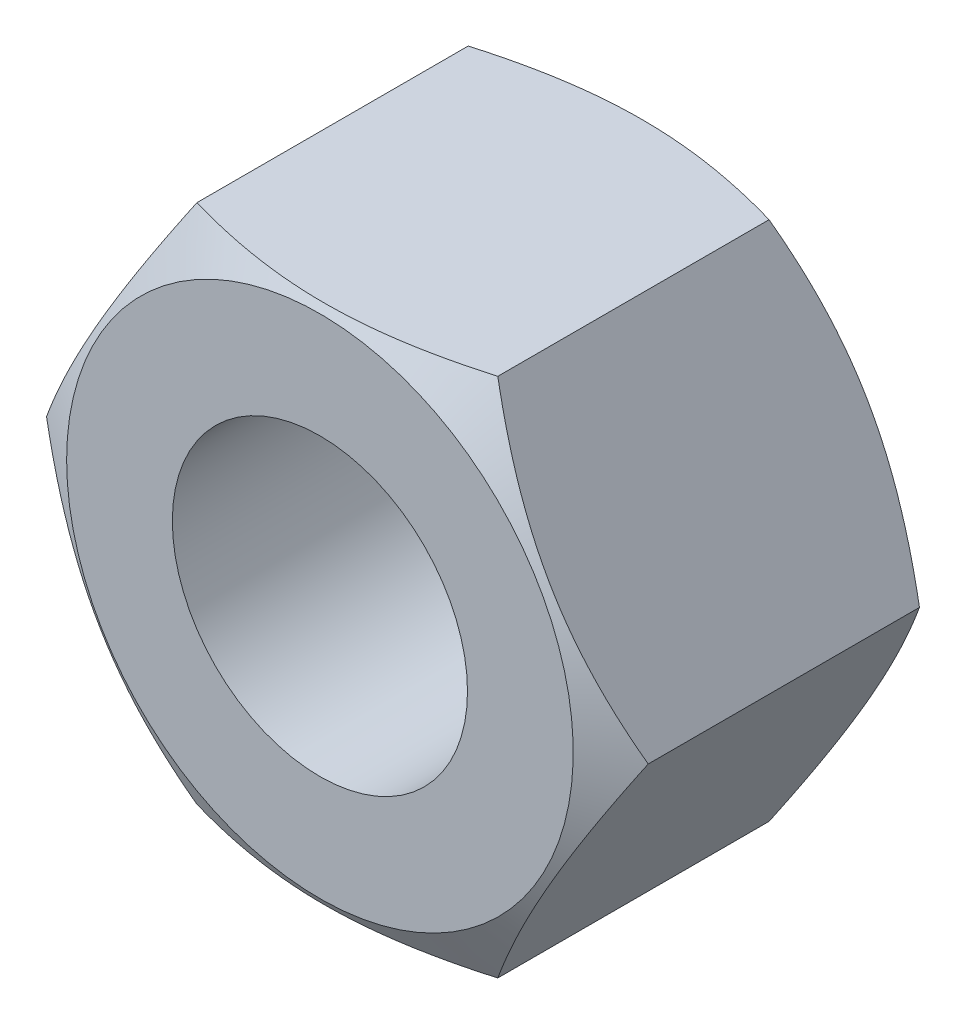
ISO-10303-21;
HEADER;
FILE_DESCRIPTION(('STEP AP214'),'2;1');
FILE_NAME('part.step','',(''),(''),'','','');
FILE_SCHEMA(('AUTOMOTIVE_DESIGN { 1 0 10303 214 1 1 1 1 }'));
ENDSEC;
DATA;
#1=APPLICATION_CONTEXT('core data for automotive mechanical design processes');
#2=APPLICATION_PROTOCOL_DEFINITION('international standard','automotive_design',2000,#1);
#3=PRODUCT_CONTEXT('',#1,'mechanical');
#4=PRODUCT('Part','Part','',(#3));
#5=PRODUCT_RELATED_PRODUCT_CATEGORY('part','',(#4));
#6=PRODUCT_DEFINITION_FORMATION('','',#4);
#7=PRODUCT_DEFINITION_CONTEXT('part definition',#1,'design');
#8=PRODUCT_DEFINITION('design','',#6,#7);
#9=PRODUCT_DEFINITION_SHAPE('','',#8);
#10=(LENGTH_UNIT() NAMED_UNIT(*) SI_UNIT(.MILLI.,.METRE.));
#11=(NAMED_UNIT(*) PLANE_ANGLE_UNIT() SI_UNIT($,.RADIAN.));
#12=(NAMED_UNIT(*) SI_UNIT($,.STERADIAN.) SOLID_ANGLE_UNIT());
#13=UNCERTAINTY_MEASURE_WITH_UNIT(LENGTH_MEASURE(1.E-05),#10,'distance_accuracy_value','');
#14=(GEOMETRIC_REPRESENTATION_CONTEXT(3) GLOBAL_UNCERTAINTY_ASSIGNED_CONTEXT((#13)) GLOBAL_UNIT_ASSIGNED_CONTEXT((#10,
#11,#12)) REPRESENTATION_CONTEXT('',''));
#15=CARTESIAN_POINT('',(0.,0.,0.));
#16=DIRECTION('',(0.,0.,1.));
#17=DIRECTION('',(1.,0.,0.));
#18=AXIS2_PLACEMENT_3D('',#15,#16,#17);
#19=CARTESIAN_POINT('',(-7.79422863405995,-13.5,-16.9));
#20=DIRECTION('',(0.,-1.,0.));
#21=DIRECTION('',(1.,0.,0.));
#22=AXIS2_PLACEMENT_3D('',#19,#20,#21);
#23=PLANE('',#22);
#24=CARTESIAN_POINT('',(-20.6414283385698,-13.5,-6.66211109437932));
#25=CARTESIAN_POINT('',(-20.3451927267808,-13.5,-6.518977463411));
#26=CARTESIAN_POINT('',(-20.0485981988826,-13.5,-6.37658702899362));
#27=CARTESIAN_POINT('',(-19.4546154711653,-13.5,-6.09346321338076));
#28=CARTESIAN_POINT('',(-19.1572272626184,-13.5,-5.9527298505004));
#29=CARTESIAN_POINT('',(-18.2636707981027,-13.5,-5.53323036770217));
#30=CARTESIAN_POINT('',(-17.6662075189161,-13.5,-5.25721176821301));
#31=CARTESIAN_POINT('',(-16.4637078583372,-13.5,-4.71270348756273));
#32=CARTESIAN_POINT('',(-15.8586476857994,-13.5,-4.44426621498114));
#33=CARTESIAN_POINT('',(-14.6435437872288,-13.5,-3.91896041597388));
#34=CARTESIAN_POINT('',(-14.0335003238415,-13.5,-3.66209128443499));
#35=CARTESIAN_POINT('',(-12.8000265686481,-13.5,-3.16001432582822));
#36=CARTESIAN_POINT('',(-12.1765235408417,-13.5,-2.91498425361256));
#37=CARTESIAN_POINT('',(-10.9221482383828,-13.5,-2.44418904112871));
#38=CARTESIAN_POINT('',(-10.2912751521263,-13.5,-2.21842604576006));
#39=CARTESIAN_POINT('',(-9.02248270739626,-13.5,-1.79225611887085));
#40=CARTESIAN_POINT('',(-8.38458169534984,-13.5,-1.59179501541417));
#41=CARTESIAN_POINT('',(-7.09965072984675,-13.5,-1.22274885775889));
#42=CARTESIAN_POINT('',(-6.45262373924203,-13.5,-1.05415370276057));
#43=CARTESIAN_POINT('',(-5.47511363721056,-13.5,-0.831345367377567));
#44=CARTESIAN_POINT('',(-5.14803929115925,-13.5,-0.762077517534783));
#45=CARTESIAN_POINT('',(-4.49171982223577,-13.5,-0.634667658219002));
#46=CARTESIAN_POINT('',(-4.16247474862902,-13.5,-0.576525397139815));
#47=CARTESIAN_POINT('',(-3.50203087840567,-13.5,-0.472398237436892));
#48=CARTESIAN_POINT('',(-3.17083192659608,-13.5,-0.426414318189659));
#49=CARTESIAN_POINT('',(-2.50688059847814,-13.5,-0.347531347849764));
#50=CARTESIAN_POINT('',(-2.17412827826878,-13.5,-0.314631827864259));
#51=CARTESIAN_POINT('',(-1.5096319936846,-13.5,-0.262798795995755));
#52=CARTESIAN_POINT('',(-1.17789481074892,-13.5,-0.243778914869455));
#53=CARTESIAN_POINT('',(-0.513914290149798,-13.5,-0.219805703775309));
#54=CARTESIAN_POINT('',(-0.181670960174335,-13.5,-0.214852162240556));
#55=CARTESIAN_POINT('',(0.48263327442963,-13.5,-0.219128943000607));
#56=CARTESIAN_POINT('',(0.814694204093622,-13.5,-0.228355313208164));
#57=CARTESIAN_POINT('',(1.47813858620015,-13.5,-0.260763416881033));
#58=CARTESIAN_POINT('',(1.80952200208806,-13.5,-0.283945884384676));
#59=CARTESIAN_POINT('',(2.61341486376691,-13.5,-0.356629567708614));
#60=CARTESIAN_POINT('',(3.0853008080866,-13.5,-0.413162953040908));
#61=CARTESIAN_POINT('',(4.02535578598045,-13.5,-0.551374254135369));
#62=CARTESIAN_POINT('',(4.49352425354811,-13.5,-0.63305592631876));
#63=CARTESIAN_POINT('',(5.89328012633227,-13.5,-0.911724054982504));
#64=CARTESIAN_POINT('',(6.81828677930942,-13.5,-1.14214702482224));
#65=CARTESIAN_POINT('',(8.20188355841416,-13.5,-1.53921658252512));
#66=CARTESIAN_POINT('',(8.66770896091092,-13.5,-1.68207852899575));
#67=CARTESIAN_POINT('',(9.59485931230503,-13.5,-1.98198274248303));
#68=CARTESIAN_POINT('',(10.0561838521939,-13.5,-2.13902628517189));
#69=CARTESIAN_POINT('',(10.9720319069463,-13.5,-2.46395228175173));
#70=CARTESIAN_POINT('',(11.4265791181124,-13.5,-2.63176850524613));
#71=CARTESIAN_POINT('',(12.1055407344645,-13.5,-2.89072738097578));
#72=CARTESIAN_POINT('',(12.3313483643177,-13.5,-2.97823799001403));
#73=CARTESIAN_POINT('',(12.7820876205276,-13.5,-3.1554748324667));
#74=CARTESIAN_POINT('',(13.0070192641565,-13.5,-3.24520102193667));
#75=CARTESIAN_POINT('',(13.2315433934192,-13.5,-3.33593491894165));
#76=B_SPLINE_CURVE_WITH_KNOTS('',3,(#24,#25,#26,#27,#28,#29,#30,#31,#32,#33,#34,#35,#36,#37,#38,
#39,#40,#41,#42,#43,#44,#45,#46,#47,#48,#49,#50,#51,#52,#53,#54,#55,#56,#57,#58,#59,#60,#61,#62,
#63,#64,#65,#66,#67,#68,#69,#70,#71,#72,#73,#74,#75),.UNSPECIFIED.,.F.,.F.,(4,2,2,2,2,2,2,2,2,2,
2,2,2,2,2,2,2,2,2,2,2,2,2,2,2,4),(0.,0.987006155465804,1.97402320980206,3.94838004987342,
5.93408786164919,7.91969168290323,9.92921514417375,11.9389620238043,13.9443302417995,
15.9490617325321,16.9518889656412,17.954693517041,18.9575788215754,19.960428183449,
20.9569825950948,21.9535220178338,22.9497837451503,23.9460978766726,25.3710686514636,
26.7962523787141,29.6521174036425,31.1137236922342,32.5754615874032,34.0289432911614,
34.755448624192,35.4819395590642),.UNSPECIFIED.);
#77=CARTESIAN_POINT('',(-7.79422863405994,-13.5,-1.42227771688614));
#78=VERTEX_POINT('',#77);
#79=CARTESIAN_POINT('',(7.79422863405995,-13.5,-1.42227771688614));
#80=VERTEX_POINT('',#79);
#81=EDGE_CURVE('E62',#78,#80,#76,.T.);
#82=ORIENTED_EDGE('',*,*,#81,.F.);
#83=DIRECTION('',(0.,0.,1.));
#84=VECTOR('',#83,1.);
#85=CARTESIAN_POINT('',(-7.79422863405995,-13.5,-16.9));
#86=LINE('',#85,#84);
#87=CARTESIAN_POINT('',(-7.79422863405994,-13.5,-15.4777222831139));
#88=VERTEX_POINT('',#87);
#89=EDGE_CURVE('E11',#88,#78,#86,.T.);
#90=ORIENTED_EDGE('',*,*,#89,.F.);
#91=CARTESIAN_POINT('',(-20.6414283385698,-13.5,-10.2378889056207));
#92=CARTESIAN_POINT('',(-20.3451927267808,-13.5,-10.381022536589));
#93=CARTESIAN_POINT('',(-20.0485981988826,-13.5,-10.5234129710064));
#94=CARTESIAN_POINT('',(-19.4546154711653,-13.5,-10.8065367866192));
#95=CARTESIAN_POINT('',(-19.1572272626184,-13.5,-10.9472701494996));
#96=CARTESIAN_POINT('',(-18.2636707981027,-13.5,-11.3667696322978));
#97=CARTESIAN_POINT('',(-17.6662075189161,-13.5,-11.642788231787));
#98=CARTESIAN_POINT('',(-16.4637078583372,-13.5,-12.1872965124373));
#99=CARTESIAN_POINT('',(-15.8586476857994,-13.5,-12.4557337850189));
#100=CARTESIAN_POINT('',(-14.6435437872288,-13.5,-12.9810395840261));
#101=CARTESIAN_POINT('',(-14.0335003238415,-13.5,-13.237908715565));
#102=CARTESIAN_POINT('',(-12.8000265686481,-13.5,-13.7399856741718));
#103=CARTESIAN_POINT('',(-12.1765235408417,-13.5,-13.9850157463874));
#104=CARTESIAN_POINT('',(-10.9221482383828,-13.5,-14.4558109588713));
#105=CARTESIAN_POINT('',(-10.2912751521263,-13.5,-14.6815739542399));
#106=CARTESIAN_POINT('',(-9.02248270739626,-13.5,-15.1077438811291));
#107=CARTESIAN_POINT('',(-8.38458169534985,-13.5,-15.3082049845858));
#108=CARTESIAN_POINT('',(-7.09965072984675,-13.5,-15.6772511422411));
#109=CARTESIAN_POINT('',(-6.45262373924204,-13.5,-15.8458462972394));
#110=CARTESIAN_POINT('',(-5.47511363721056,-13.5,-16.0686546326224));
#111=CARTESIAN_POINT('',(-5.14803929115926,-13.5,-16.1379224824652));
#112=CARTESIAN_POINT('',(-4.49171982223577,-13.5,-16.265332341781));
#113=CARTESIAN_POINT('',(-4.16247474862903,-13.5,-16.3234746028602));
#114=CARTESIAN_POINT('',(-3.50203087840568,-13.5,-16.4276017625631));
#115=CARTESIAN_POINT('',(-3.17083192659609,-13.5,-16.4735856818103));
#116=CARTESIAN_POINT('',(-2.50688059847815,-13.5,-16.5524686521502));
#117=CARTESIAN_POINT('',(-2.17412827826878,-13.5,-16.5853681721357));
#118=CARTESIAN_POINT('',(-1.5096319936846,-13.5,-16.6372012040042));
#119=CARTESIAN_POINT('',(-1.17789481074893,-13.5,-16.6562210851305));
#120=CARTESIAN_POINT('',(-0.513914290149802,-13.5,-16.6801942962247));
#121=CARTESIAN_POINT('',(-0.181670960174338,-13.5,-16.6851478377594));
#122=CARTESIAN_POINT('',(0.48263327442963,-13.5,-16.6808710569994));
#123=CARTESIAN_POINT('',(0.814694204093623,-13.5,-16.6716446867918));
#124=CARTESIAN_POINT('',(1.47813858620016,-13.5,-16.639236583119));
#125=CARTESIAN_POINT('',(1.80952200208806,-13.5,-16.6160541156153));
#126=CARTESIAN_POINT('',(2.61341486376691,-13.5,-16.5433704322914));
#127=CARTESIAN_POINT('',(3.0853008080866,-13.5,-16.4868370469591));
#128=CARTESIAN_POINT('',(4.02535578598046,-13.5,-16.3486257458646));
#129=CARTESIAN_POINT('',(4.49352425354812,-13.5,-16.2669440736812));
#130=CARTESIAN_POINT('',(5.89328012633228,-13.5,-15.9882759450175));
#131=CARTESIAN_POINT('',(6.81828677930943,-13.5,-15.7578529751778));
#132=CARTESIAN_POINT('',(8.20188355841417,-13.5,-15.3607834174749));
#133=CARTESIAN_POINT('',(8.66770896091093,-13.5,-15.2179214710042));
#134=CARTESIAN_POINT('',(9.59485931230504,-13.5,-14.918017257517));
#135=CARTESIAN_POINT('',(10.0561838521939,-13.5,-14.7609737148281));
#136=CARTESIAN_POINT('',(10.9720319069463,-13.5,-14.4360477182483));
#137=CARTESIAN_POINT('',(11.4265791181124,-13.5,-14.2682314947539));
#138=CARTESIAN_POINT('',(12.1055407344645,-13.5,-14.0092726190242));
#139=CARTESIAN_POINT('',(12.3313483643178,-13.5,-13.921762009986));
#140=CARTESIAN_POINT('',(12.7820876205276,-13.5,-13.7445251675333));
#141=CARTESIAN_POINT('',(13.0070192641565,-13.5,-13.6547989780633));
#142=CARTESIAN_POINT('',(13.2315433934192,-13.5,-13.5640650810583));
#143=B_SPLINE_CURVE_WITH_KNOTS('',3,(#91,#92,#93,#94,#95,#96,#97,#98,#99,#100,#101,#102,#103,
#104,#105,#106,#107,#108,#109,#110,#111,#112,#113,#114,#115,#116,#117,#118,#119,#120,#121,#122,
#123,#124,#125,#126,#127,#128,#129,#130,#131,#132,#133,#134,#135,#136,#137,#138,#139,#140,#141,
#142),.UNSPECIFIED.,.F.,.F.,(4,2,2,2,2,2,2,2,2,2,2,2,2,2,2,2,2,2,2,2,2,2,2,2,2,4),(0.,
0.9870061554658,1.97402320980206,3.94838004987342,5.93408786164919,7.91969168290323,
9.92921514417375,11.9389620238043,13.9443302417995,15.9490617325321,16.9518889656412,
17.954693517041,18.9575788215754,19.960428183449,20.9569825950948,21.9535220178339,
22.9497837451503,23.9460978766726,25.3710686514636,26.7962523787141,29.6521174036425,
31.1137236922342,32.5754615874032,34.0289432911615,34.755448624192,35.4819395590642),.UNSPECIFIED.);
#144=CARTESIAN_POINT('',(7.79422863405995,-13.5,-15.4777222831139));
#145=VERTEX_POINT('',#144);
#146=EDGE_CURVE('E141',#145,#88,#143,.F.);
#147=ORIENTED_EDGE('',*,*,#146,.F.);
#148=DIRECTION('',(0.,0.,1.));
#149=VECTOR('',#148,1.);
#150=CARTESIAN_POINT('',(7.79422863405995,-13.5,-16.9));
#151=LINE('',#150,#149);
#152=EDGE_CURVE('E49',#145,#80,#151,.T.);
#153=ORIENTED_EDGE('',*,*,#152,.T.);
#154=EDGE_LOOP('',(#82,#90,#147,#153));
#155=FACE_BOUND('',#154,.T.);
#156=ADVANCED_FACE('F45',(#155),#23,.T.);
#157=CARTESIAN_POINT('',(-15.5884572681199,0.,-16.9));
#158=DIRECTION('',(-0.866025403784438,-0.5,0.));
#159=DIRECTION('',(0.5,-0.866025403784439,0.));
#160=AXIS2_PLACEMENT_3D('',#157,#158,#159);
#161=PLANE('',#160);
#162=CARTESIAN_POINT('',(-15.5885727381737,0.000200000000001838,-1.42234438429355));
#163=CARTESIAN_POINT('',(-15.4172585590749,-0.296524862256052,-1.32344235279898));
#164=CARTESIAN_POINT('',(-15.2452761625602,-0.59440711102707,-1.22902828985184));
#165=CARTESIAN_POINT('',(-14.899932271808,-1.19256027589336,-1.05042360582435));
#166=CARTESIAN_POINT('',(-14.7265703438498,-1.49283194321508,-0.966236347209941));
#167=CARTESIAN_POINT('',(-14.3781323446498,-2.09634426111705,-0.809216917781722));
#168=CARTESIAN_POINT('',(-14.2030532243114,-2.39959019288772,-0.736411613541345));
#169=CARTESIAN_POINT('',(-13.8516783921556,-3.00818925468255,-0.603719435353392));
#170=CARTESIAN_POINT('',(-13.6753827503359,-3.31354226346713,-0.543831824423678));
#171=CARTESIAN_POINT('',(-13.3260922517071,-3.91853115369337,-0.439522261585169));
#172=CARTESIAN_POINT('',(-13.1531233267183,-4.21812211990455,-0.394755064570657));
#173=CARTESIAN_POINT('',(-12.8063928945171,-4.81867684500741,-0.319690286629368));
#174=CARTESIAN_POINT('',(-12.632631372114,-5.11964063020999,-0.289392984213117));
#175=CARTESIAN_POINT('',(-12.284816427587,-5.72207378576257,-0.244032985143185));
#176=CARTESIAN_POINT('',(-12.1107635996896,-6.02354212688191,-0.228952184974798));
#177=CARTESIAN_POINT('',(-11.7624972706325,-6.62675710337428,-0.214349514613708));
#178=CARTESIAN_POINT('',(-11.5882837746037,-6.92850372986035,-0.214827163673637));
#179=CARTESIAN_POINT('',(-11.2625921885179,-7.49261810455857,-0.230254684590672));
#180=CARTESIAN_POINT('',(-11.1110908897329,-7.75502605146695,-0.243322769939135));
#181=CARTESIAN_POINT('',(-10.8084367795058,-8.27923834749989,-0.280978920904704));
#182=CARTESIAN_POINT('',(-10.6572839934736,-8.54104265261318,-0.305567801373089));
#183=CARTESIAN_POINT('',(-10.3554090101392,-9.06390546128244,-0.365836816382126));
#184=CARTESIAN_POINT('',(-10.2046872726121,-9.32496316848428,-0.40152611145324));
#185=CARTESIAN_POINT('',(-9.90395041171111,-9.84585469127366,-0.483369789658436));
#186=CARTESIAN_POINT('',(-9.75393533708269,-10.1056884224313,-0.529524884237762));
#187=CARTESIAN_POINT('',(-9.29855621514213,-10.8944281983385,-0.684855610218756));
#188=CARTESIAN_POINT('',(-8.99451087657251,-11.4210501725455,-0.809519384371486));
#189=CARTESIAN_POINT('',(-8.39095390705817,-12.4664415090067,-1.09245521851808));
#190=CARTESIAN_POINT('',(-8.09143454846038,-12.9852242559485,-1.2506608293193));
#191=CARTESIAN_POINT('',(-7.79411316400611,-13.5002,-1.42234438429354));
#192=B_SPLINE_CURVE_WITH_KNOTS('',3,(#162,#163,#164,#165,#166,#167,#168,#169,#170,#171,#172,
#173,#174,#175,#176,#177,#178,#179,#180,#181,#182,#183,#184,#185,#186,#187,#188,#189,#190,#191),
.UNSPECIFIED.,.F.,.F.,(4,2,2,2,2,2,2,2,2,2,2,2,2,2,4),(0.,1.0698794936454,2.14010980578041,
3.21282939735428,4.28548777177524,5.33167033690336,6.37787303770781,7.42282956789443,
8.46775380954026,9.37738732544599,10.2870851882952,11.1975357730373,12.1080482670512,
13.9691139233208,15.8265265395635),.UNSPECIFIED.);
#193=CARTESIAN_POINT('',(-15.5884572681199,0.,-1.42227771688614));
#194=VERTEX_POINT('',#193);
#195=EDGE_CURVE('E102',#194,#78,#192,.T.);
#196=ORIENTED_EDGE('',*,*,#195,.F.);
#197=DIRECTION('',(0.,0.,1.));
#198=VECTOR('',#197,1.);
#199=CARTESIAN_POINT('',(-15.5884572681199,0.,-16.9));
#200=LINE('',#199,#198);
#201=CARTESIAN_POINT('',(-15.5884572681199,0.,-15.4777222831139));
#202=VERTEX_POINT('',#201);
#203=EDGE_CURVE('E54',#202,#194,#200,.T.);
#204=ORIENTED_EDGE('',*,*,#203,.F.);
#205=CARTESIAN_POINT('',(-7.79411316400611,-13.5002,-15.4776556157065));
#206=CARTESIAN_POINT('',(-7.9654273431049,-13.2034751377439,-15.576557647201));
#207=CARTESIAN_POINT('',(-8.13740973961965,-12.9055928889729,-15.6709717101482));
#208=CARTESIAN_POINT('',(-8.48275363037183,-12.3074397241066,-15.8495763941756));
#209=CARTESIAN_POINT('',(-8.65611555833005,-12.0071680567849,-15.9337636527901));
#210=CARTESIAN_POINT('',(-9.00455355753,-11.403655738883,-16.0907830822183));
#211=CARTESIAN_POINT('',(-9.17963267786846,-11.1004098071123,-16.1635883864587));
#212=CARTESIAN_POINT('',(-9.53100751002426,-10.4918107453174,-16.2962805646466));
#213=CARTESIAN_POINT('',(-9.7073031518439,-10.1864577365329,-16.3561681755763));
#214=CARTESIAN_POINT('',(-10.0565936504727,-9.58146884630663,-16.4604777384148));
#215=CARTESIAN_POINT('',(-10.2295625754616,-9.28187788009545,-16.5052449354293));
#216=CARTESIAN_POINT('',(-10.5762930076628,-8.68132315499259,-16.5803097133706));
#217=CARTESIAN_POINT('',(-10.7500545300658,-8.38035936979001,-16.6106070157869));
#218=CARTESIAN_POINT('',(-11.0978694745929,-7.77792621423743,-16.6559670148568));
#219=CARTESIAN_POINT('',(-11.2719223024903,-7.47645787311809,-16.6710478150252));
#220=CARTESIAN_POINT('',(-11.6201886315474,-6.87324289662572,-16.6856504853863));
#221=CARTESIAN_POINT('',(-11.7944021275761,-6.57149627013965,-16.6851728363264));
#222=CARTESIAN_POINT('',(-12.1200937136619,-6.00738189544143,-16.6697453154093));
#223=CARTESIAN_POINT('',(-12.271595012447,-5.74497394853305,-16.6566772300609));
#224=CARTESIAN_POINT('',(-12.5742491226741,-5.22076165250011,-16.6190210790953));
#225=CARTESIAN_POINT('',(-12.7254019087062,-4.95895734738682,-16.5944321986269));
#226=CARTESIAN_POINT('',(-13.0272768920407,-4.43609453871757,-16.5341631836179));
#227=CARTESIAN_POINT('',(-13.1779986295677,-4.17503683151572,-16.4984738885468));
#228=CARTESIAN_POINT('',(-13.4787354904687,-3.65414530872635,-16.4166302103416));
#229=CARTESIAN_POINT('',(-13.6287505650971,-3.39431157756869,-16.3704751157622));
#230=CARTESIAN_POINT('',(-14.0841296870377,-2.60557180166152,-16.2151443897812));
#231=CARTESIAN_POINT('',(-14.3881750256073,-2.07894982745447,-16.0904806156285));
#232=CARTESIAN_POINT('',(-14.9917319951217,-1.03355849099333,-15.8075447814819));
#233=CARTESIAN_POINT('',(-15.2912513537195,-0.514775744051517,-15.6493391706807));
#234=CARTESIAN_POINT('',(-15.5885727381737,0.000200000000001723,-15.4776556157065));
#235=B_SPLINE_CURVE_WITH_KNOTS('',3,(#205,#206,#207,#208,#209,#210,#211,#212,#213,#214,#215,
#216,#217,#218,#219,#220,#221,#222,#223,#224,#225,#226,#227,#228,#229,#230,#231,#232,#233,#234),
.UNSPECIFIED.,.F.,.F.,(4,2,2,2,2,2,2,2,2,2,2,2,2,2,4),(0.,1.0698794936454,2.14010980578041,
3.21282939735428,4.28548777177524,5.33167033690335,6.3778730377078,7.42282956789442,
8.46775380954025,9.37738732544598,10.2870851882952,11.1975357730373,12.1080482670512,
13.9691139233208,15.8265265395635),.UNSPECIFIED.);
#236=EDGE_CURVE('E149',#88,#202,#235,.T.);
#237=ORIENTED_EDGE('',*,*,#236,.F.);
#238=ORIENTED_EDGE('',*,*,#89,.T.);
#239=EDGE_LOOP('',(#196,#204,#237,#238));
#240=FACE_BOUND('',#239,.T.);
#241=ADVANCED_FACE('F112',(#240),#161,.T.);
#242=CARTESIAN_POINT('',(-7.79422863405995,13.5,-16.9));
#243=DIRECTION('',(-0.866025403784439,0.5,0.));
#244=DIRECTION('',(-0.5,-0.866025403784439,0.));
#245=AXIS2_PLACEMENT_3D('',#242,#243,#244);
#246=PLANE('',#245);
#247=CARTESIAN_POINT('',(-7.79411316400611,13.5002,-1.42234438429355));
#248=CARTESIAN_POINT('',(-7.9654273431049,13.2034751377439,-1.32344235279898));
#249=CARTESIAN_POINT('',(-8.13740973961966,12.9055928889729,-1.22902828985184));
#250=CARTESIAN_POINT('',(-8.48275363037184,12.3074397241066,-1.05042360582435));
#251=CARTESIAN_POINT('',(-8.65611555833005,12.0071680567849,-0.96623634720994));
#252=CARTESIAN_POINT('',(-9.00455355753,11.403655738883,-0.809216917781722));
#253=CARTESIAN_POINT('',(-9.17963267786847,11.1004098071123,-0.736411613541346));
#254=CARTESIAN_POINT('',(-9.53100751002426,10.4918107453174,-0.603719435353392));
#255=CARTESIAN_POINT('',(-9.7073031518439,10.1864577365329,-0.543831824423678));
#256=CARTESIAN_POINT('',(-10.0565936504728,9.58146884630663,-0.439522261585169));
#257=CARTESIAN_POINT('',(-10.2295625754616,9.28187788009545,-0.394755064570657));
#258=CARTESIAN_POINT('',(-10.5762930076628,8.68132315499259,-0.319690286629369));
#259=CARTESIAN_POINT('',(-10.7500545300658,8.38035936979001,-0.289392984213118));
#260=CARTESIAN_POINT('',(-11.0978694745929,7.77792621423743,-0.244032985143186));
#261=CARTESIAN_POINT('',(-11.2719223024903,7.47645787311809,-0.228952184974799));
#262=CARTESIAN_POINT('',(-11.6201886315474,6.87324289662572,-0.214349514613708));
#263=CARTESIAN_POINT('',(-11.7944021275762,6.57149627013965,-0.214827163673638));
#264=CARTESIAN_POINT('',(-12.1200937136619,6.00738189544143,-0.230254684590673));
#265=CARTESIAN_POINT('',(-12.271595012447,5.74497394853305,-0.243322769939136));
#266=CARTESIAN_POINT('',(-12.5742491226741,5.22076165250011,-0.280978920904706));
#267=CARTESIAN_POINT('',(-12.7254019087062,4.95895734738682,-0.305567801373091));
#268=CARTESIAN_POINT('',(-13.0272768920407,4.43609453871756,-0.365836816382128));
#269=CARTESIAN_POINT('',(-13.1779986295677,4.17503683151572,-0.401526111453241));
#270=CARTESIAN_POINT('',(-13.4787354904687,3.65414530872635,-0.483369789658437));
#271=CARTESIAN_POINT('',(-13.6287505650971,3.39431157756869,-0.529524884237764));
#272=CARTESIAN_POINT('',(-14.0841296870377,2.60557180166153,-0.68485561021876));
#273=CARTESIAN_POINT('',(-14.3881750256073,2.07894982745447,-0.80951938437149));
#274=CARTESIAN_POINT('',(-14.9917319951217,1.03355849099334,-1.09245521851808));
#275=CARTESIAN_POINT('',(-15.2912513537195,0.514775744051519,-1.2506608293193));
#276=CARTESIAN_POINT('',(-15.5885727381737,-0.000199999999998483,-1.42234438429355));
#277=B_SPLINE_CURVE_WITH_KNOTS('',3,(#247,#248,#249,#250,#251,#252,#253,#254,#255,#256,#257,
#258,#259,#260,#261,#262,#263,#264,#265,#266,#267,#268,#269,#270,#271,#272,#273,#274,#275,#276),
.UNSPECIFIED.,.F.,.F.,(4,2,2,2,2,2,2,2,2,2,2,2,2,2,4),(0.,1.0698794936454,2.14010980578041,
3.21282939735429,4.28548777177525,5.33167033690336,6.37787303770781,7.42282956789443,
8.46775380954026,9.37738732544599,10.2870851882952,11.1975357730373,12.1080482670512,
13.9691139233208,15.8265265395635),.UNSPECIFIED.);
#278=CARTESIAN_POINT('',(-7.79422863405996,13.5,-1.42227771688614));
#279=VERTEX_POINT('',#278);
#280=EDGE_CURVE('E98',#279,#194,#277,.T.);
#281=ORIENTED_EDGE('',*,*,#280,.F.);
#282=DIRECTION('',(0.,0.,1.));
#283=VECTOR('',#282,1.);
#284=CARTESIAN_POINT('',(-7.79422863405995,13.5,-16.9));
#285=LINE('',#284,#283);
#286=CARTESIAN_POINT('',(-7.79422863405995,13.5,-15.4777222831139));
#287=VERTEX_POINT('',#286);
#288=EDGE_CURVE('E119',#287,#279,#285,.T.);
#289=ORIENTED_EDGE('',*,*,#288,.F.);
#290=CARTESIAN_POINT('',(-15.5885727381737,-0.000199999999998287,-15.4776556157065));
#291=CARTESIAN_POINT('',(-15.4172585590749,0.296524862256056,-15.576557647201));
#292=CARTESIAN_POINT('',(-15.2452761625602,0.594407111027075,-15.6709717101482));
#293=CARTESIAN_POINT('',(-14.899932271808,1.19256027589336,-15.8495763941756));
#294=CARTESIAN_POINT('',(-14.7265703438498,1.49283194321508,-15.9337636527901));
#295=CARTESIAN_POINT('',(-14.3781323446498,2.09634426111705,-16.0907830822183));
#296=CARTESIAN_POINT('',(-14.2030532243114,2.39959019288773,-16.1635883864587));
#297=CARTESIAN_POINT('',(-13.8516783921556,3.00818925468256,-16.2962805646466));
#298=CARTESIAN_POINT('',(-13.6753827503359,3.31354226346714,-16.3561681755763));
#299=CARTESIAN_POINT('',(-13.3260922517071,3.91853115369338,-16.4604777384148));
#300=CARTESIAN_POINT('',(-13.1531233267183,4.21812211990455,-16.5052449354293));
#301=CARTESIAN_POINT('',(-12.8063928945171,4.81867684500741,-16.5803097133706));
#302=CARTESIAN_POINT('',(-12.632631372114,5.11964063020999,-16.6106070157869));
#303=CARTESIAN_POINT('',(-12.284816427587,5.72207378576257,-16.6559670148568));
#304=CARTESIAN_POINT('',(-12.1107635996896,6.02354212688191,-16.6710478150252));
#305=CARTESIAN_POINT('',(-11.7624972706325,6.62675710337429,-16.6856504853863));
#306=CARTESIAN_POINT('',(-11.5882837746037,6.92850372986036,-16.6851728363264));
#307=CARTESIAN_POINT('',(-11.2625921885179,7.49261810455857,-16.6697453154093));
#308=CARTESIAN_POINT('',(-11.1110908897329,7.75502605146696,-16.6566772300609));
#309=CARTESIAN_POINT('',(-10.8084367795058,8.27923834749989,-16.6190210790953));
#310=CARTESIAN_POINT('',(-10.6572839934736,8.54104265261318,-16.5944321986269));
#311=CARTESIAN_POINT('',(-10.3554090101392,9.06390546128244,-16.5341631836179));
#312=CARTESIAN_POINT('',(-10.2046872726121,9.32496316848428,-16.4984738885468));
#313=CARTESIAN_POINT('',(-9.90395041171111,9.84585469127366,-16.4166302103416));
#314=CARTESIAN_POINT('',(-9.7539353370827,10.1056884224313,-16.3704751157622));
#315=CARTESIAN_POINT('',(-9.29855621514213,10.8944281983385,-16.2151443897812));
#316=CARTESIAN_POINT('',(-8.99451087657251,11.4210501725455,-16.0904806156285));
#317=CARTESIAN_POINT('',(-8.39095390705817,12.4664415090067,-15.8075447814819));
#318=CARTESIAN_POINT('',(-8.09143454846038,12.9852242559485,-15.6493391706807));
#319=CARTESIAN_POINT('',(-7.79411316400611,13.5002,-15.4776556157065));
#320=B_SPLINE_CURVE_WITH_KNOTS('',3,(#290,#291,#292,#293,#294,#295,#296,#297,#298,#299,#300,
#301,#302,#303,#304,#305,#306,#307,#308,#309,#310,#311,#312,#313,#314,#315,#316,#317,#318,#319),
.UNSPECIFIED.,.F.,.F.,(4,2,2,2,2,2,2,2,2,2,2,2,2,2,4),(0.,1.0698794936454,2.14010980578041,
3.21282939735429,4.28548777177524,5.33167033690335,6.37787303770781,7.42282956789443,
8.46775380954026,9.37738732544598,10.2870851882952,11.1975357730373,12.1080482670512,
13.9691139233208,15.8265265395635),.UNSPECIFIED.);
#321=EDGE_CURVE('E118',#202,#287,#320,.T.);
#322=ORIENTED_EDGE('',*,*,#321,.F.);
#323=ORIENTED_EDGE('',*,*,#203,.T.);
#324=EDGE_LOOP('',(#281,#289,#322,#323));
#325=FACE_BOUND('',#324,.T.);
#326=ADVANCED_FACE('F117',(#325),#246,.T.);
#327=CARTESIAN_POINT('',(7.79422863405994,13.5,-16.9));
#328=DIRECTION('',(0.,1.,0.));
#329=DIRECTION('',(0.,0.,1.));
#330=AXIS2_PLACEMENT_3D('',#327,#328,#329);
#331=PLANE('',#330);
#332=CARTESIAN_POINT('',(-20.6414283385698,13.5,-6.66211109437932));
#333=CARTESIAN_POINT('',(-20.3451927267808,13.5,-6.518977463411));
#334=CARTESIAN_POINT('',(-20.0485981988826,13.5,-6.37658702899362));
#335=CARTESIAN_POINT('',(-19.4546154711653,13.5,-6.09346321338076));
#336=CARTESIAN_POINT('',(-19.1572272626184,13.5,-5.9527298505004));
#337=CARTESIAN_POINT('',(-18.2636707981027,13.5,-5.53323036770217));
#338=CARTESIAN_POINT('',(-17.6662075189161,13.5,-5.25721176821301));
#339=CARTESIAN_POINT('',(-16.4637078583372,13.5,-4.71270348756274));
#340=CARTESIAN_POINT('',(-15.8586476857994,13.5,-4.44426621498114));
#341=CARTESIAN_POINT('',(-14.6435437872288,13.5,-3.91896041597388));
#342=CARTESIAN_POINT('',(-14.0335003238415,13.5,-3.662091284435));
#343=CARTESIAN_POINT('',(-12.8000265686481,13.5,-3.16001432582823));
#344=CARTESIAN_POINT('',(-12.1765235408417,13.5,-2.91498425361256));
#345=CARTESIAN_POINT('',(-10.9221482383828,13.5,-2.44418904112871));
#346=CARTESIAN_POINT('',(-10.2912751521263,13.5,-2.21842604576006));
#347=CARTESIAN_POINT('',(-9.02248270739627,13.5,-1.79225611887085));
#348=CARTESIAN_POINT('',(-8.38458169534985,13.5,-1.59179501541417));
#349=CARTESIAN_POINT('',(-7.09965072984675,13.5,-1.22274885775889));
#350=CARTESIAN_POINT('',(-6.45262373924203,13.5,-1.05415370276057));
#351=CARTESIAN_POINT('',(-5.47511363721056,13.5,-0.831345367377569));
#352=CARTESIAN_POINT('',(-5.14803929115926,13.5,-0.762077517534785));
#353=CARTESIAN_POINT('',(-4.49171982223577,13.5,-0.634667658219005));
#354=CARTESIAN_POINT('',(-4.16247474862902,13.5,-0.576525397139817));
#355=CARTESIAN_POINT('',(-3.50203087840568,13.5,-0.472398237436894));
#356=CARTESIAN_POINT('',(-3.17083192659609,13.5,-0.426414318189661));
#357=CARTESIAN_POINT('',(-2.50688059847815,13.5,-0.347531347849767));
#358=CARTESIAN_POINT('',(-2.17412827826878,13.5,-0.314631827864262));
#359=CARTESIAN_POINT('',(-1.5096319936846,13.5,-0.262798795995758));
#360=CARTESIAN_POINT('',(-1.17789481074892,13.5,-0.243778914869457));
#361=CARTESIAN_POINT('',(-0.513914290149801,13.5,-0.219805703775311));
#362=CARTESIAN_POINT('',(-0.181670960174338,13.5,-0.214852162240558));
#363=CARTESIAN_POINT('',(0.48263327442963,13.5,-0.219128943000609));
#364=CARTESIAN_POINT('',(0.814694204093624,13.5,-0.228355313208167));
#365=CARTESIAN_POINT('',(1.47813858620016,13.5,-0.260763416881035));
#366=CARTESIAN_POINT('',(1.80952200208806,13.5,-0.283945884384679));
#367=CARTESIAN_POINT('',(2.61341486376691,13.5,-0.356629567708617));
#368=CARTESIAN_POINT('',(3.08530080808659,13.5,-0.413162953040911));
#369=CARTESIAN_POINT('',(4.02535578598045,13.5,-0.551374254135371));
#370=CARTESIAN_POINT('',(4.49352425354811,13.5,-0.633055926318762));
#371=CARTESIAN_POINT('',(5.89328012633227,13.5,-0.911724054982505));
#372=CARTESIAN_POINT('',(6.81828677930942,13.5,-1.14214702482224));
#373=CARTESIAN_POINT('',(8.20188355841416,13.5,-1.53921658252512));
#374=CARTESIAN_POINT('',(8.66770896091092,13.5,-1.68207852899575));
#375=CARTESIAN_POINT('',(9.59485931230503,13.5,-1.98198274248304));
#376=CARTESIAN_POINT('',(10.0561838521939,13.5,-2.13902628517189));
#377=CARTESIAN_POINT('',(10.9720319069463,13.5,-2.46395228175173));
#378=CARTESIAN_POINT('',(11.4265791181124,13.5,-2.63176850524613));
#379=CARTESIAN_POINT('',(12.1055407344645,13.5,-2.89072738097579));
#380=CARTESIAN_POINT('',(12.3313483643177,13.5,-2.97823799001403));
#381=CARTESIAN_POINT('',(12.7820876205276,13.5,-3.15547483246671));
#382=CARTESIAN_POINT('',(13.0070192641565,13.5,-3.24520102193668));
#383=CARTESIAN_POINT('',(13.2315433934192,13.5,-3.33593491894166));
#384=B_SPLINE_CURVE_WITH_KNOTS('',3,(#332,#333,#334,#335,#336,#337,#338,#339,#340,#341,#342,
#343,#344,#345,#346,#347,#348,#349,#350,#351,#352,#353,#354,#355,#356,#357,#358,#359,#360,#361,
#362,#363,#364,#365,#366,#367,#368,#369,#370,#371,#372,#373,#374,#375,#376,#377,#378,#379,#380,
#381,#382,#383),.UNSPECIFIED.,.F.,.F.,(4,2,2,2,2,2,2,2,2,2,2,2,2,2,2,2,2,2,2,2,2,2,2,2,2,4),(0.,
0.987006155465804,1.97402320980206,3.94838004987343,5.9340878616492,7.91969168290323,
9.92921514417375,11.9389620238043,13.9443302417995,15.9490617325321,16.9518889656412,
17.954693517041,18.9575788215754,19.9604281834491,20.9569825950948,21.9535220178339,
22.9497837451503,23.9460978766726,25.3710686514636,26.7962523787141,29.6521174036425,
31.1137236922342,32.5754615874032,34.0289432911615,34.755448624192,35.4819395590642),.UNSPECIFIED.);
#385=CARTESIAN_POINT('',(7.79422863405994,13.5,-1.42227771688614));
#386=VERTEX_POINT('',#385);
#387=EDGE_CURVE('E104',#386,#279,#384,.F.);
#388=ORIENTED_EDGE('',*,*,#387,.F.);
#389=DIRECTION('',(0.,0.,1.));
#390=VECTOR('',#389,1.);
#391=CARTESIAN_POINT('',(7.79422863405994,13.5,-16.9));
#392=LINE('',#391,#390);
#393=CARTESIAN_POINT('',(7.79422863405994,13.5,-15.4777222831139));
#394=VERTEX_POINT('',#393);
#395=EDGE_CURVE('E121',#394,#386,#392,.T.);
#396=ORIENTED_EDGE('',*,*,#395,.F.);
#397=CARTESIAN_POINT('',(-20.6414283385698,13.5,-10.2378889056207));
#398=CARTESIAN_POINT('',(-20.3451927267808,13.5,-10.381022536589));
#399=CARTESIAN_POINT('',(-20.0485981988826,13.5,-10.5234129710064));
#400=CARTESIAN_POINT('',(-19.4546154711653,13.5,-10.8065367866192));
#401=CARTESIAN_POINT('',(-19.1572272626184,13.5,-10.9472701494996));
#402=CARTESIAN_POINT('',(-18.2636707981027,13.5,-11.3667696322978));
#403=CARTESIAN_POINT('',(-17.6662075189161,13.5,-11.642788231787));
#404=CARTESIAN_POINT('',(-16.4637078583372,13.5,-12.1872965124373));
#405=CARTESIAN_POINT('',(-15.8586476857994,13.5,-12.4557337850189));
#406=CARTESIAN_POINT('',(-14.6435437872288,13.5,-12.9810395840261));
#407=CARTESIAN_POINT('',(-14.0335003238415,13.5,-13.237908715565));
#408=CARTESIAN_POINT('',(-12.8000265686481,13.5,-13.7399856741718));
#409=CARTESIAN_POINT('',(-12.1765235408417,13.5,-13.9850157463874));
#410=CARTESIAN_POINT('',(-10.9221482383828,13.5,-14.4558109588713));
#411=CARTESIAN_POINT('',(-10.2912751521263,13.5,-14.6815739542399));
#412=CARTESIAN_POINT('',(-9.02248270739627,13.5,-15.1077438811291));
#413=CARTESIAN_POINT('',(-8.38458169534985,13.5,-15.3082049845858));
#414=CARTESIAN_POINT('',(-7.09965072984675,13.5,-15.6772511422411));
#415=CARTESIAN_POINT('',(-6.45262373924203,13.5,-15.8458462972394));
#416=CARTESIAN_POINT('',(-5.47511363721056,13.5,-16.0686546326224));
#417=CARTESIAN_POINT('',(-5.14803929115926,13.5,-16.1379224824652));
#418=CARTESIAN_POINT('',(-4.49171982223577,13.5,-16.265332341781));
#419=CARTESIAN_POINT('',(-4.16247474862903,13.5,-16.3234746028602));
#420=CARTESIAN_POINT('',(-3.50203087840568,13.5,-16.4276017625631));
#421=CARTESIAN_POINT('',(-3.17083192659609,13.5,-16.4735856818103));
#422=CARTESIAN_POINT('',(-2.50688059847815,13.5,-16.5524686521502));
#423=CARTESIAN_POINT('',(-2.17412827826878,13.5,-16.5853681721357));
#424=CARTESIAN_POINT('',(-1.5096319936846,13.5,-16.6372012040042));
#425=CARTESIAN_POINT('',(-1.17789481074892,13.5,-16.6562210851305));
#426=CARTESIAN_POINT('',(-0.513914290149802,13.5,-16.6801942962247));
#427=CARTESIAN_POINT('',(-0.181670960174338,13.5,-16.6851478377594));
#428=CARTESIAN_POINT('',(0.482633274429629,13.5,-16.6808710569994));
#429=CARTESIAN_POINT('',(0.814694204093623,13.5,-16.6716446867918));
#430=CARTESIAN_POINT('',(1.47813858620015,13.5,-16.639236583119));
#431=CARTESIAN_POINT('',(1.80952200208806,13.5,-16.6160541156153));
#432=CARTESIAN_POINT('',(2.61341486376691,13.5,-16.5433704322914));
#433=CARTESIAN_POINT('',(3.08530080808659,13.5,-16.4868370469591));
#434=CARTESIAN_POINT('',(4.02535578598045,13.5,-16.3486257458646));
#435=CARTESIAN_POINT('',(4.49352425354811,13.5,-16.2669440736812));
#436=CARTESIAN_POINT('',(5.89328012633227,13.5,-15.9882759450175));
#437=CARTESIAN_POINT('',(6.81828677930942,13.5,-15.7578529751778));
#438=CARTESIAN_POINT('',(8.20188355841416,13.5,-15.3607834174749));
#439=CARTESIAN_POINT('',(8.66770896091093,13.5,-15.2179214710042));
#440=CARTESIAN_POINT('',(9.59485931230503,13.5,-14.918017257517));
#441=CARTESIAN_POINT('',(10.0561838521939,13.5,-14.7609737148281));
#442=CARTESIAN_POINT('',(10.9720319069463,13.5,-14.4360477182483));
#443=CARTESIAN_POINT('',(11.4265791181124,13.5,-14.2682314947539));
#444=CARTESIAN_POINT('',(12.1055407344645,13.5,-14.0092726190242));
#445=CARTESIAN_POINT('',(12.3313483643177,13.5,-13.921762009986));
#446=CARTESIAN_POINT('',(12.7820876205276,13.5,-13.7445251675333));
#447=CARTESIAN_POINT('',(13.0070192641565,13.5,-13.6547989780633));
#448=CARTESIAN_POINT('',(13.2315433934192,13.5,-13.5640650810583));
#449=B_SPLINE_CURVE_WITH_KNOTS('',3,(#397,#398,#399,#400,#401,#402,#403,#404,#405,#406,#407,
#408,#409,#410,#411,#412,#413,#414,#415,#416,#417,#418,#419,#420,#421,#422,#423,#424,#425,#426,
#427,#428,#429,#430,#431,#432,#433,#434,#435,#436,#437,#438,#439,#440,#441,#442,#443,#444,#445,
#446,#447,#448),.UNSPECIFIED.,.F.,.F.,(4,2,2,2,2,2,2,2,2,2,2,2,2,2,2,2,2,2,2,2,2,2,2,2,2,4),(0.,
0.987006155465804,1.97402320980206,3.94838004987343,5.9340878616492,7.91969168290323,
9.92921514417375,11.9389620238043,13.9443302417995,15.9490617325321,16.9518889656412,
17.9546935170411,18.9575788215754,19.9604281834491,20.9569825950948,21.9535220178339,
22.9497837451503,23.9460978766726,25.3710686514636,26.7962523787141,29.6521174036425,
31.1137236922342,32.5754615874032,34.0289432911615,34.755448624192,35.4819395590642),.UNSPECIFIED.);
#450=EDGE_CURVE('E183',#287,#394,#449,.T.);
#451=ORIENTED_EDGE('',*,*,#450,.F.);
#452=ORIENTED_EDGE('',*,*,#288,.T.);
#453=EDGE_LOOP('',(#388,#396,#451,#452));
#454=FACE_BOUND('',#453,.T.);
#455=ADVANCED_FACE('F196',(#454),#331,.T.);
#456=CARTESIAN_POINT('',(15.5884572681199,0.,-16.9));
#457=DIRECTION('',(0.866025403784438,0.5,0.));
#458=DIRECTION('',(-0.5,0.866025403784438,0.));
#459=AXIS2_PLACEMENT_3D('',#456,#457,#458);
#460=PLANE('',#459);
#461=CARTESIAN_POINT('',(15.5885727381737,-0.000199999999993025,-1.42234438429355));
#462=CARTESIAN_POINT('',(15.4172585590749,0.296524862256061,-1.32344235279898));
#463=CARTESIAN_POINT('',(15.2452761625602,0.594407111027079,-1.22902828985185));
#464=CARTESIAN_POINT('',(14.899932271808,1.19256027589337,-1.05042360582435));
#465=CARTESIAN_POINT('',(14.7265703438498,1.49283194321509,-0.966236347209941));
#466=CARTESIAN_POINT('',(14.3781323446498,2.09634426111705,-0.809216917781722));
#467=CARTESIAN_POINT('',(14.2030532243114,2.39959019288773,-0.736411613541345));
#468=CARTESIAN_POINT('',(13.8516783921556,3.00818925468256,-0.603719435353392));
#469=CARTESIAN_POINT('',(13.6753827503359,3.31354226346714,-0.543831824423679));
#470=CARTESIAN_POINT('',(13.3260922517071,3.91853115369338,-0.43952226158517));
#471=CARTESIAN_POINT('',(13.1531233267183,4.21812211990456,-0.394755064570657));
#472=CARTESIAN_POINT('',(12.8063928945171,4.81867684500742,-0.319690286629369));
#473=CARTESIAN_POINT('',(12.632631372114,5.11964063020999,-0.289392984213119));
#474=CARTESIAN_POINT('',(12.284816427587,5.72207378576257,-0.244032985143186));
#475=CARTESIAN_POINT('',(12.1107635996896,6.02354212688191,-0.2289521849748));
#476=CARTESIAN_POINT('',(11.7624972706325,6.62675710337429,-0.214349514613708));
#477=CARTESIAN_POINT('',(11.5882837746037,6.92850372986036,-0.214827163673637));
#478=CARTESIAN_POINT('',(11.2625921885179,7.49261810455858,-0.230254684590672));
#479=CARTESIAN_POINT('',(11.1110908897329,7.75502605146696,-0.243322769939136));
#480=CARTESIAN_POINT('',(10.8084367795058,8.27923834749989,-0.280978920904706));
#481=CARTESIAN_POINT('',(10.6572839934736,8.54104265261318,-0.305567801373091));
#482=CARTESIAN_POINT('',(10.3554090101392,9.06390546128244,-0.365836816382128));
#483=CARTESIAN_POINT('',(10.2046872726121,9.32496316848429,-0.401526111453241));
#484=CARTESIAN_POINT('',(9.90395041171111,9.84585469127366,-0.483369789658437));
#485=CARTESIAN_POINT('',(9.75393533708269,10.1056884224313,-0.529524884237763));
#486=CARTESIAN_POINT('',(9.29855621514213,10.8944281983385,-0.684855610218759));
#487=CARTESIAN_POINT('',(8.99451087657251,11.4210501725455,-0.809519384371489));
#488=CARTESIAN_POINT('',(8.39095390705817,12.4664415090067,-1.09245521851808));
#489=CARTESIAN_POINT('',(8.09143454846038,12.9852242559485,-1.2506608293193));
#490=CARTESIAN_POINT('',(7.79411316400611,13.5002,-1.42234438429354));
#491=B_SPLINE_CURVE_WITH_KNOTS('',3,(#461,#462,#463,#464,#465,#466,#467,#468,#469,#470,#471,
#472,#473,#474,#475,#476,#477,#478,#479,#480,#481,#482,#483,#484,#485,#486,#487,#488,#489,#490),
.UNSPECIFIED.,.F.,.F.,(4,2,2,2,2,2,2,2,2,2,2,2,2,2,4),(0.,1.0698794936454,2.14010980578041,
3.21282939735428,4.28548777177524,5.33167033690335,6.37787303770781,7.42282956789443,
8.46775380954026,9.37738732544598,10.2870851882952,11.1975357730373,12.1080482670512,
13.9691139233208,15.8265265395635),.UNSPECIFIED.);
#492=CARTESIAN_POINT('',(15.5884572681199,0.,-1.42227771688614));
#493=VERTEX_POINT('',#492);
#494=EDGE_CURVE('E231',#493,#386,#491,.T.);
#495=ORIENTED_EDGE('',*,*,#494,.F.);
#496=DIRECTION('',(0.,0.,1.));
#497=VECTOR('',#496,1.);
#498=CARTESIAN_POINT('',(15.5884572681199,0.,-16.9));
#499=LINE('',#498,#497);
#500=CARTESIAN_POINT('',(15.5884572681199,0.,-15.4777222831139));
#501=VERTEX_POINT('',#500);
#502=EDGE_CURVE('E126',#501,#493,#499,.T.);
#503=ORIENTED_EDGE('',*,*,#502,.F.);
#504=CARTESIAN_POINT('',(7.79411316400611,13.5002,-15.4776556157065));
#505=CARTESIAN_POINT('',(7.96542734310489,13.2034751377439,-15.576557647201));
#506=CARTESIAN_POINT('',(8.13740973961965,12.9055928889729,-15.6709717101482));
#507=CARTESIAN_POINT('',(8.48275363037183,12.3074397241066,-15.8495763941756));
#508=CARTESIAN_POINT('',(8.65611555833004,12.0071680567849,-15.9337636527901));
#509=CARTESIAN_POINT('',(9.00455355753,11.403655738883,-16.0907830822183));
#510=CARTESIAN_POINT('',(9.17963267786846,11.1004098071123,-16.1635883864587));
#511=CARTESIAN_POINT('',(9.53100751002426,10.4918107453174,-16.2962805646466));
#512=CARTESIAN_POINT('',(9.7073031518439,10.1864577365329,-16.3561681755763));
#513=CARTESIAN_POINT('',(10.0565936504727,9.58146884630663,-16.4604777384148));
#514=CARTESIAN_POINT('',(10.2295625754616,9.28187788009545,-16.5052449354293));
#515=CARTESIAN_POINT('',(10.5762930076628,8.68132315499259,-16.5803097133706));
#516=CARTESIAN_POINT('',(10.7500545300658,8.38035936979001,-16.6106070157869));
#517=CARTESIAN_POINT('',(11.0978694745929,7.77792621423744,-16.6559670148568));
#518=CARTESIAN_POINT('',(11.2719223024903,7.4764578731181,-16.6710478150252));
#519=CARTESIAN_POINT('',(11.6201886315474,6.87324289662572,-16.6856504853863));
#520=CARTESIAN_POINT('',(11.7944021275762,6.57149627013965,-16.6851728363264));
#521=CARTESIAN_POINT('',(12.1200937136619,6.00738189544143,-16.6697453154093));
#522=CARTESIAN_POINT('',(12.271595012447,5.74497394853305,-16.6566772300609));
#523=CARTESIAN_POINT('',(12.5742491226741,5.22076165250012,-16.6190210790953));
#524=CARTESIAN_POINT('',(12.7254019087062,4.95895734738682,-16.5944321986269));
#525=CARTESIAN_POINT('',(13.0272768920407,4.43609453871757,-16.5341631836179));
#526=CARTESIAN_POINT('',(13.1779986295677,4.17503683151572,-16.4984738885468));
#527=CARTESIAN_POINT('',(13.4787354904687,3.65414530872635,-16.4166302103416));
#528=CARTESIAN_POINT('',(13.6287505650971,3.3943115775687,-16.3704751157622));
#529=CARTESIAN_POINT('',(14.0841296870377,2.60557180166153,-16.2151443897812));
#530=CARTESIAN_POINT('',(14.3881750256073,2.07894982745447,-16.0904806156285));
#531=CARTESIAN_POINT('',(14.9917319951217,1.03355849099334,-15.8075447814819));
#532=CARTESIAN_POINT('',(15.2912513537195,0.514775744051525,-15.6493391706807));
#533=CARTESIAN_POINT('',(15.5885727381737,-0.000199999999993043,-15.4776556157065));
#534=B_SPLINE_CURVE_WITH_KNOTS('',3,(#504,#505,#506,#507,#508,#509,#510,#511,#512,#513,#514,
#515,#516,#517,#518,#519,#520,#521,#522,#523,#524,#525,#526,#527,#528,#529,#530,#531,#532,#533),
.UNSPECIFIED.,.F.,.F.,(4,2,2,2,2,2,2,2,2,2,2,2,2,2,4),(0.,1.0698794936454,2.14010980578041,
3.21282939735428,4.28548777177524,5.33167033690335,6.37787303770781,7.42282956789443,
8.46775380954026,9.37738732544598,10.2870851882952,11.1975357730373,12.1080482670512,
13.9691139233208,15.8265265395635),.UNSPECIFIED.);
#535=EDGE_CURVE('E70',#394,#501,#534,.T.);
#536=ORIENTED_EDGE('',*,*,#535,.F.);
#537=ORIENTED_EDGE('',*,*,#395,.T.);
#538=EDGE_LOOP('',(#495,#503,#536,#537));
#539=FACE_BOUND('',#538,.T.);
#540=ADVANCED_FACE('F230',(#539),#460,.T.);
#541=CARTESIAN_POINT('',(7.79422863405995,-13.5,-16.9));
#542=DIRECTION('',(0.866025403784439,-0.5,0.));
#543=DIRECTION('',(0.5,0.866025403784439,0.));
#544=AXIS2_PLACEMENT_3D('',#541,#542,#543);
#545=PLANE('',#544);
#546=CARTESIAN_POINT('',(7.79411316400611,-13.5002,-1.42234438429354));
#547=CARTESIAN_POINT('',(7.9654273431049,-13.2034751377439,-1.32344235279898));
#548=CARTESIAN_POINT('',(8.13740973961966,-12.9055928889729,-1.22902828985184));
#549=CARTESIAN_POINT('',(8.48275363037184,-12.3074397241066,-1.05042360582435));
#550=CARTESIAN_POINT('',(8.65611555833005,-12.0071680567849,-0.966236347209939));
#551=CARTESIAN_POINT('',(9.00455355753,-11.403655738883,-0.809216917781721));
#552=CARTESIAN_POINT('',(9.17963267786846,-11.1004098071123,-0.736411613541344));
#553=CARTESIAN_POINT('',(9.53100751002426,-10.4918107453174,-0.603719435353391));
#554=CARTESIAN_POINT('',(9.7073031518439,-10.1864577365329,-0.543831824423677));
#555=CARTESIAN_POINT('',(10.0565936504728,-9.58146884630662,-0.439522261585168));
#556=CARTESIAN_POINT('',(10.2295625754616,-9.28187788009544,-0.394755064570656));
#557=CARTESIAN_POINT('',(10.5762930076628,-8.68132315499259,-0.319690286629368));
#558=CARTESIAN_POINT('',(10.7500545300658,-8.38035936979001,-0.289392984213117));
#559=CARTESIAN_POINT('',(11.0978694745929,-7.77792621423743,-0.244032985143185));
#560=CARTESIAN_POINT('',(11.2719223024903,-7.47645787311809,-0.228952184974798));
#561=CARTESIAN_POINT('',(11.6201886315474,-6.87324289662571,-0.214349514613707));
#562=CARTESIAN_POINT('',(11.7944021275762,-6.57149627013964,-0.214827163673637));
#563=CARTESIAN_POINT('',(12.1200937136619,-6.00738189544142,-0.230254684590671));
#564=CARTESIAN_POINT('',(12.271595012447,-5.74497394853304,-0.243322769939135));
#565=CARTESIAN_POINT('',(12.5742491226741,-5.22076165250011,-0.280978920904703));
#566=CARTESIAN_POINT('',(12.7254019087062,-4.95895734738682,-0.305567801373089));
#567=CARTESIAN_POINT('',(13.0272768920407,-4.43609453871756,-0.365836816382126));
#568=CARTESIAN_POINT('',(13.1779986295677,-4.17503683151571,-0.40152611145324));
#569=CARTESIAN_POINT('',(13.4787354904687,-3.65414530872634,-0.483369789658436));
#570=CARTESIAN_POINT('',(13.6287505650971,-3.39431157756869,-0.529524884237762));
#571=CARTESIAN_POINT('',(14.0841296870377,-2.60557180166152,-0.684855610218758));
#572=CARTESIAN_POINT('',(14.3881750256073,-2.07894982745446,-0.809519384371488));
#573=CARTESIAN_POINT('',(14.9917319951217,-1.03355849099333,-1.09245521851808));
#574=CARTESIAN_POINT('',(15.2912513537195,-0.514775744051513,-1.2506608293193));
#575=CARTESIAN_POINT('',(15.5885727381737,0.000200000000006301,-1.42234438429354));
#576=B_SPLINE_CURVE_WITH_KNOTS('',3,(#546,#547,#548,#549,#550,#551,#552,#553,#554,#555,#556,
#557,#558,#559,#560,#561,#562,#563,#564,#565,#566,#567,#568,#569,#570,#571,#572,#573,#574,#575),
.UNSPECIFIED.,.F.,.F.,(4,2,2,2,2,2,2,2,2,2,2,2,2,2,4),(0.,1.0698794936454,2.14010980578041,
3.21282939735428,4.28548777177524,5.33167033690335,6.3778730377078,7.42282956789443,
8.46775380954025,9.37738732544598,10.2870851882952,11.1975357730373,12.1080482670512,
13.9691139233208,15.8265265395635),.UNSPECIFIED.);
#577=EDGE_CURVE('E232',#80,#493,#576,.T.);
#578=ORIENTED_EDGE('',*,*,#577,.F.);
#579=ORIENTED_EDGE('',*,*,#152,.F.);
#580=CARTESIAN_POINT('',(15.5885727381737,0.000200000000007043,-15.4776556157065));
#581=CARTESIAN_POINT('',(15.4172585590749,-0.296524862256048,-15.576557647201));
#582=CARTESIAN_POINT('',(15.2452761625602,-0.594407111027067,-15.6709717101482));
#583=CARTESIAN_POINT('',(14.899932271808,-1.19256027589336,-15.8495763941756));
#584=CARTESIAN_POINT('',(14.7265703438498,-1.49283194321507,-15.9337636527901));
#585=CARTESIAN_POINT('',(14.3781323446498,-2.09634426111704,-16.0907830822183));
#586=CARTESIAN_POINT('',(14.2030532243114,-2.39959019288772,-16.1635883864587));
#587=CARTESIAN_POINT('',(13.8516783921556,-3.00818925468255,-16.2962805646466));
#588=CARTESIAN_POINT('',(13.6753827503359,-3.31354226346713,-16.3561681755763));
#589=CARTESIAN_POINT('',(13.3260922517071,-3.91853115369337,-16.4604777384148));
#590=CARTESIAN_POINT('',(13.1531233267183,-4.21812211990455,-16.5052449354293));
#591=CARTESIAN_POINT('',(12.8063928945171,-4.8186768450074,-16.5803097133706));
#592=CARTESIAN_POINT('',(12.632631372114,-5.11964063020998,-16.6106070157869));
#593=CARTESIAN_POINT('',(12.284816427587,-5.72207378576256,-16.6559670148568));
#594=CARTESIAN_POINT('',(12.1107635996896,-6.0235421268819,-16.6710478150252));
#595=CARTESIAN_POINT('',(11.7624972706325,-6.62675710337428,-16.6856504853863));
#596=CARTESIAN_POINT('',(11.5882837746037,-6.92850372986035,-16.6851728363264));
#597=CARTESIAN_POINT('',(11.2625921885179,-7.49261810455857,-16.6697453154093));
#598=CARTESIAN_POINT('',(11.1110908897329,-7.75502605146695,-16.6566772300609));
#599=CARTESIAN_POINT('',(10.8084367795058,-8.27923834749988,-16.6190210790953));
#600=CARTESIAN_POINT('',(10.6572839934736,-8.54104265261318,-16.5944321986269));
#601=CARTESIAN_POINT('',(10.3554090101392,-9.06390546128243,-16.5341631836179));
#602=CARTESIAN_POINT('',(10.2046872726121,-9.32496316848428,-16.4984738885468));
#603=CARTESIAN_POINT('',(9.90395041171112,-9.84585469127365,-16.4166302103416));
#604=CARTESIAN_POINT('',(9.7539353370827,-10.1056884224313,-16.3704751157622));
#605=CARTESIAN_POINT('',(9.29855621514213,-10.8944281983385,-16.2151443897812));
#606=CARTESIAN_POINT('',(8.99451087657251,-11.4210501725455,-16.0904806156285));
#607=CARTESIAN_POINT('',(8.39095390705818,-12.4664415090067,-15.8075447814819));
#608=CARTESIAN_POINT('',(8.09143454846038,-12.9852242559485,-15.6493391706807));
#609=CARTESIAN_POINT('',(7.79411316400611,-13.5002,-15.4776556157065));
#610=B_SPLINE_CURVE_WITH_KNOTS('',3,(#580,#581,#582,#583,#584,#585,#586,#587,#588,#589,#590,
#591,#592,#593,#594,#595,#596,#597,#598,#599,#600,#601,#602,#603,#604,#605,#606,#607,#608,#609),
.UNSPECIFIED.,.F.,.F.,(4,2,2,2,2,2,2,2,2,2,2,2,2,2,4),(0.,1.0698794936454,2.14010980578041,
3.21282939735429,4.28548777177524,5.33167033690335,6.37787303770781,7.42282956789443,
8.46775380954026,9.37738732544598,10.2870851882952,11.1975357730373,12.1080482670512,
13.9691139233208,15.8265265395635),.UNSPECIFIED.);
#611=EDGE_CURVE('E167',#501,#145,#610,.T.);
#612=ORIENTED_EDGE('',*,*,#611,.F.);
#613=ORIENTED_EDGE('',*,*,#502,.T.);
#614=EDGE_LOOP('',(#578,#579,#612,#613));
#615=FACE_BOUND('',#614,.T.);
#616=ADVANCED_FACE('F246',(#615),#545,.T.);
#617=CARTESIAN_POINT('',(7.79422863405995,-13.5,-16.9));
#618=DIRECTION('',(0.,0.,1.));
#619=DIRECTION('',(1.,0.,0.));
#620=AXIS2_PLACEMENT_3D('',#617,#618,#619);
#621=PLANE('',#620);
#622=CARTESIAN_POINT('',(0.,0.,-16.9));
#623=DIRECTION('',(0.,0.,-1.));
#624=DIRECTION('',(-1.,0.,0.));
#625=AXIS2_PLACEMENT_3D('',#622,#623,#624);
#626=CIRCLE('',#625,13.125);
#627=CARTESIAN_POINT('',(-13.125,0.,-16.9));
#628=VERTEX_POINT('',#627);
#629=EDGE_CURVE('E220',#628,#628,#626,.T.);
#630=ORIENTED_EDGE('',*,*,#629,.T.);
#631=EDGE_LOOP('',(#630));
#632=FACE_BOUND('',#631,.T.);
#633=CARTESIAN_POINT('',(0.,0.,-16.9));
#634=DIRECTION('',(0.,0.,1.));
#635=DIRECTION('',(1.,0.,0.));
#636=AXIS2_PLACEMENT_3D('',#633,#634,#635);
#637=CIRCLE('',#636,7.647);
#638=CARTESIAN_POINT('',(7.647,0.,-16.9));
#639=VERTEX_POINT('',#638);
#640=EDGE_CURVE('E131',#639,#639,#637,.T.);
#641=ORIENTED_EDGE('',*,*,#640,.T.);
#642=EDGE_LOOP('',(#641));
#643=FACE_BOUND('',#642,.T.);
#644=ADVANCED_FACE('F250',(#632,#643),#621,.F.);
#645=CARTESIAN_POINT('',(7.79422863405995,-13.5,0.));
#646=DIRECTION('',(0.,0.,1.));
#647=DIRECTION('',(1.,0.,0.));
#648=AXIS2_PLACEMENT_3D('',#645,#646,#647);
#649=PLANE('',#648);
#650=CARTESIAN_POINT('',(0.,0.,0.));
#651=DIRECTION('',(0.,0.,-1.));
#652=DIRECTION('',(-1.,0.,0.));
#653=AXIS2_PLACEMENT_3D('',#650,#651,#652);
#654=CIRCLE('',#653,13.125);
#655=CARTESIAN_POINT('',(-13.125,0.,0.));
#656=VERTEX_POINT('',#655);
#657=EDGE_CURVE('E233',#656,#656,#654,.T.);
#658=ORIENTED_EDGE('',*,*,#657,.F.);
#659=EDGE_LOOP('',(#658));
#660=FACE_BOUND('',#659,.T.);
#661=CARTESIAN_POINT('',(0.,0.,0.));
#662=DIRECTION('',(0.,0.,1.));
#663=DIRECTION('',(1.,0.,0.));
#664=AXIS2_PLACEMENT_3D('',#661,#662,#663);
#665=CIRCLE('',#664,7.647);
#666=CARTESIAN_POINT('',(7.647,0.,0.));
#667=VERTEX_POINT('',#666);
#668=EDGE_CURVE('E136',#667,#667,#665,.T.);
#669=ORIENTED_EDGE('',*,*,#668,.F.);
#670=EDGE_LOOP('',(#669));
#671=FACE_BOUND('',#670,.T.);
#672=ADVANCED_FACE('F255',(#660,#671),#649,.T.);
#673=CARTESIAN_POINT('',(0.,0.,-16.9));
#674=DIRECTION('',(0.,0.,1.));
#675=DIRECTION('',(1.,0.,0.));
#676=AXIS2_PLACEMENT_3D('',#673,#674,#675);
#677=CYLINDRICAL_SURFACE('',#676,7.647);
#678=ORIENTED_EDGE('',*,*,#640,.F.);
#679=EDGE_LOOP('',(#678));
#680=FACE_BOUND('',#679,.T.);
#681=ORIENTED_EDGE('',*,*,#668,.T.);
#682=EDGE_LOOP('',(#681));
#683=FACE_BOUND('',#682,.T.);
#684=ADVANCED_FACE('F161',(#680,#683),#677,.F.);
#685=CARTESIAN_POINT('',(0.,0.,-15.4777222831139));
#686=DIRECTION('',(0.,0.,1.));
#687=DIRECTION('',(1.,0.,0.));
#688=AXIS2_PLACEMENT_3D('',#685,#686,#687);
#689=CONICAL_SURFACE('',#688,15.5884572681199,1.0471975511966);
#690=ORIENTED_EDGE('',*,*,#146,.T.);
#691=ORIENTED_EDGE('',*,*,#236,.T.);
#692=ORIENTED_EDGE('',*,*,#321,.T.);
#693=ORIENTED_EDGE('',*,*,#450,.T.);
#694=ORIENTED_EDGE('',*,*,#535,.T.);
#695=ORIENTED_EDGE('',*,*,#611,.T.);
#696=EDGE_LOOP('',(#690,#691,#692,#693,#694,#695));
#697=FACE_BOUND('',#696,.T.);
#698=ORIENTED_EDGE('',*,*,#629,.F.);
#699=EDGE_LOOP('',(#698));
#700=FACE_BOUND('',#699,.T.);
#701=ADVANCED_FACE('F156',(#697,#700),#689,.T.);
#702=CARTESIAN_POINT('',(0.,0.,0.));
#703=DIRECTION('',(0.,0.,-1.));
#704=DIRECTION('',(-1.,0.,0.));
#705=AXIS2_PLACEMENT_3D('',#702,#703,#704);
#706=CONICAL_SURFACE('',#705,13.125,1.0471975511966);
#707=ORIENTED_EDGE('',*,*,#81,.T.);
#708=ORIENTED_EDGE('',*,*,#577,.T.);
#709=ORIENTED_EDGE('',*,*,#494,.T.);
#710=ORIENTED_EDGE('',*,*,#387,.T.);
#711=ORIENTED_EDGE('',*,*,#280,.T.);
#712=ORIENTED_EDGE('',*,*,#195,.T.);
#713=EDGE_LOOP('',(#707,#708,#709,#710,#711,#712));
#714=FACE_BOUND('',#713,.T.);
#715=ORIENTED_EDGE('',*,*,#657,.T.);
#716=EDGE_LOOP('',(#715));
#717=FACE_BOUND('',#716,.T.);
#718=ADVANCED_FACE('F100',(#714,#717),#706,.T.);
#719=CLOSED_SHELL('',(#156,#241,#326,#455,#540,#616,#644,#672,#684,#701,#718));
#720=MANIFOLD_SOLID_BREP('B2',#719);
#721=ADVANCED_BREP_SHAPE_REPRESENTATION('',(#18,#720),#14);
#722=SHAPE_DEFINITION_REPRESENTATION(#9,#721);
ENDSEC;
END-ISO-10303-21;
